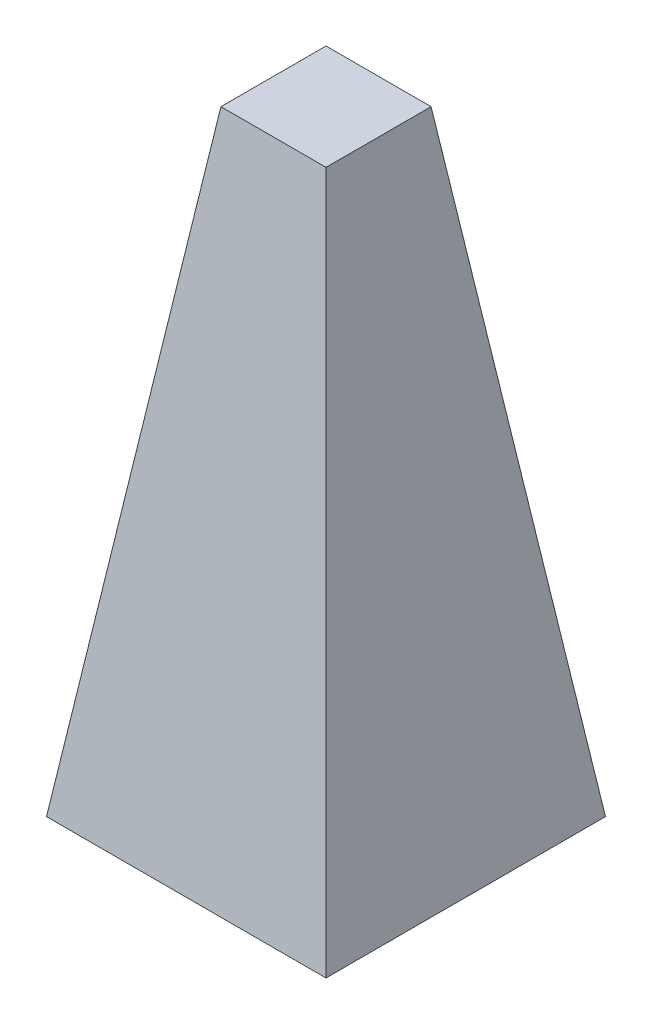
ISO-10303-21;
HEADER;
FILE_DESCRIPTION(('STEP AP214'),'2;1');
FILE_NAME('part.step','',(''),(''),'','','');
FILE_SCHEMA(('AUTOMOTIVE_DESIGN { 1 0 10303 214 1 1 1 1 }'));
ENDSEC;
DATA;
#1=APPLICATION_CONTEXT('core data for automotive mechanical design processes');
#2=APPLICATION_PROTOCOL_DEFINITION('international standard','automotive_design',2000,#1);
#3=PRODUCT_CONTEXT('',#1,'mechanical');
#4=PRODUCT('Part','Part','',(#3));
#5=PRODUCT_RELATED_PRODUCT_CATEGORY('part','',(#4));
#6=PRODUCT_DEFINITION_FORMATION('','',#4);
#7=PRODUCT_DEFINITION_CONTEXT('part definition',#1,'design');
#8=PRODUCT_DEFINITION('design','',#6,#7);
#9=PRODUCT_DEFINITION_SHAPE('','',#8);
#10=(LENGTH_UNIT() NAMED_UNIT(*) SI_UNIT(.MILLI.,.METRE.));
#11=(NAMED_UNIT(*) PLANE_ANGLE_UNIT() SI_UNIT($,.RADIAN.));
#12=(NAMED_UNIT(*) SI_UNIT($,.STERADIAN.) SOLID_ANGLE_UNIT());
#13=UNCERTAINTY_MEASURE_WITH_UNIT(LENGTH_MEASURE(1.E-05),#10,'distance_accuracy_value','');
#14=(GEOMETRIC_REPRESENTATION_CONTEXT(3) GLOBAL_UNCERTAINTY_ASSIGNED_CONTEXT((#13)) GLOBAL_UNIT_ASSIGNED_CONTEXT((#10,
#11,#12)) REPRESENTATION_CONTEXT('',''));
#15=CARTESIAN_POINT('',(0.,0.,0.));
#16=DIRECTION('',(0.,0.,1.));
#17=DIRECTION('',(1.,0.,0.));
#18=AXIS2_PLACEMENT_3D('',#15,#16,#17);
#19=CARTESIAN_POINT('',(0.,279.4,0.));
#20=DIRECTION('',(0.,-1.,0.));
#21=DIRECTION('',(0.,0.,-1.));
#22=AXIS2_PLACEMENT_3D('',#19,#20,#21);
#23=PLANE('',#22);
#24=DIRECTION('',(0.,0.,-1.));
#25=VECTOR('',#24,1.);
#26=CARTESIAN_POINT('',(23.876,279.4,23.876));
#27=LINE('',#26,#25);
#28=CARTESIAN_POINT('',(23.876,279.4,23.876));
#29=VERTEX_POINT('',#28);
#30=CARTESIAN_POINT('',(23.876,279.4,-23.876));
#31=VERTEX_POINT('',#30);
#32=EDGE_CURVE('E223',#29,#31,#27,.T.);
#33=ORIENTED_EDGE('',*,*,#32,.T.);
#34=DIRECTION('',(-1.,0.,0.));
#35=VECTOR('',#34,1.);
#36=CARTESIAN_POINT('',(-23.876,279.4,-23.876));
#37=LINE('',#36,#35);
#38=CARTESIAN_POINT('',(-23.876,279.4,-23.876));
#39=VERTEX_POINT('',#38);
#40=EDGE_CURVE('E218',#31,#39,#37,.T.);
#41=ORIENTED_EDGE('',*,*,#40,.T.);
#42=DIRECTION('',(0.,0.,1.));
#43=VECTOR('',#42,1.);
#44=CARTESIAN_POINT('',(-23.876,279.4,23.876));
#45=LINE('',#44,#43);
#46=CARTESIAN_POINT('',(-23.876,279.4,23.876));
#47=VERTEX_POINT('',#46);
#48=EDGE_CURVE('E59',#39,#47,#45,.T.);
#49=ORIENTED_EDGE('',*,*,#48,.T.);
#50=DIRECTION('',(1.,0.,0.));
#51=VECTOR('',#50,1.);
#52=CARTESIAN_POINT('',(-23.876,279.4,23.876));
#53=LINE('',#52,#51);
#54=EDGE_CURVE('E12',#47,#29,#53,.T.);
#55=ORIENTED_EDGE('',*,*,#54,.T.);
#56=EDGE_LOOP('',(#33,#41,#49,#55));
#57=FACE_BOUND('',#56,.T.);
#58=ADVANCED_FACE('F49',(#57),#23,.F.);
#59=CARTESIAN_POINT('',(0.,0.,0.));
#60=DIRECTION('',(0.,-1.,0.));
#61=DIRECTION('',(0.,0.,-1.));
#62=AXIS2_PLACEMENT_3D('',#59,#60,#61);
#63=PLANE('',#62);
#64=DIRECTION('',(0.,0.,-1.));
#65=VECTOR('',#64,1.);
#66=CARTESIAN_POINT('',(63.5,0.,63.5));
#67=LINE('',#66,#65);
#68=CARTESIAN_POINT('',(63.5,0.,63.5));
#69=VERTEX_POINT('',#68);
#70=CARTESIAN_POINT('',(63.5,0.,-63.5));
#71=VERTEX_POINT('',#70);
#72=EDGE_CURVE('E117',#69,#71,#67,.T.);
#73=ORIENTED_EDGE('',*,*,#72,.F.);
#74=DIRECTION('',(1.,0.,0.));
#75=VECTOR('',#74,1.);
#76=CARTESIAN_POINT('',(-63.5,0.,63.5));
#77=LINE('',#76,#75);
#78=CARTESIAN_POINT('',(-63.5,0.,63.5));
#79=VERTEX_POINT('',#78);
#80=EDGE_CURVE('E101',#79,#69,#77,.T.);
#81=ORIENTED_EDGE('',*,*,#80,.F.);
#82=DIRECTION('',(0.,0.,1.));
#83=VECTOR('',#82,1.);
#84=CARTESIAN_POINT('',(-63.5,0.,63.5));
#85=LINE('',#84,#83);
#86=CARTESIAN_POINT('',(-63.5,0.,-63.5));
#87=VERTEX_POINT('',#86);
#88=EDGE_CURVE('E92',#87,#79,#85,.T.);
#89=ORIENTED_EDGE('',*,*,#88,.F.);
#90=DIRECTION('',(-1.,0.,0.));
#91=VECTOR('',#90,1.);
#92=CARTESIAN_POINT('',(-63.5,0.,-63.5));
#93=LINE('',#92,#91);
#94=EDGE_CURVE('E97',#71,#87,#93,.T.);
#95=ORIENTED_EDGE('',*,*,#94,.F.);
#96=EDGE_LOOP('',(#73,#81,#89,#95));
#97=FACE_BOUND('',#96,.T.);
#98=ADVANCED_FACE('F96',(#97),#63,.T.);
#99=CARTESIAN_POINT('',(0.,8.82790423353122,-62.2480426723356));
#100=DIRECTION('',(0.,-0.140413188225986,0.990092993901186));
#101=DIRECTION('',(0.,-0.990092993901186,-0.140413188225986));
#102=AXIS2_PLACEMENT_3D('',#99,#100,#101);
#103=PLANE('',#102);
#104=DIRECTION('',(0.13904914180307,0.980474717842158,0.13904914180307));
#105=VECTOR('',#104,1.);
#106=CARTESIAN_POINT('',(-63.5,0.,-63.5));
#107=LINE('',#106,#105);
#108=EDGE_CURVE('E113',#87,#39,#107,.T.);
#109=ORIENTED_EDGE('',*,*,#108,.T.);
#110=ORIENTED_EDGE('',*,*,#40,.F.);
#111=DIRECTION('',(-0.13904914180307,0.980474717842158,0.13904914180307));
#112=VECTOR('',#111,1.);
#113=CARTESIAN_POINT('',(63.5,0.,-63.5));
#114=LINE('',#113,#112);
#115=EDGE_CURVE('E116',#71,#31,#114,.T.);
#116=ORIENTED_EDGE('',*,*,#115,.F.);
#117=ORIENTED_EDGE('',*,*,#94,.T.);
#118=EDGE_LOOP('',(#109,#110,#116,#117));
#119=FACE_BOUND('',#118,.T.);
#120=ADVANCED_FACE('F112',(#119),#103,.F.);
#121=CARTESIAN_POINT('',(62.2480426723356,8.82790423353122,0.));
#122=DIRECTION('',(-0.990092993901186,-0.140413188225986,0.));
#123=DIRECTION('',(0.140413188225986,-0.990092993901186,0.));
#124=AXIS2_PLACEMENT_3D('',#121,#122,#123);
#125=PLANE('',#124);
#126=ORIENTED_EDGE('',*,*,#115,.T.);
#127=ORIENTED_EDGE('',*,*,#32,.F.);
#128=DIRECTION('',(-0.13904914180307,0.980474717842158,-0.13904914180307));
#129=VECTOR('',#128,1.);
#130=CARTESIAN_POINT('',(63.5,0.,63.5));
#131=LINE('',#130,#129);
#132=EDGE_CURVE('E229',#69,#29,#131,.T.);
#133=ORIENTED_EDGE('',*,*,#132,.F.);
#134=ORIENTED_EDGE('',*,*,#72,.T.);
#135=EDGE_LOOP('',(#126,#127,#133,#134));
#136=FACE_BOUND('',#135,.T.);
#137=ADVANCED_FACE('F145',(#136),#125,.F.);
#138=CARTESIAN_POINT('',(-62.2480426723356,8.82790423353123,0.));
#139=DIRECTION('',(0.990092993901186,-0.140413188225986,0.));
#140=DIRECTION('',(0.140413188225986,0.990092993901186,0.));
#141=AXIS2_PLACEMENT_3D('',#138,#139,#140);
#142=PLANE('',#141);
#143=DIRECTION('',(0.13904914180307,0.980474717842158,-0.13904914180307));
#144=VECTOR('',#143,1.);
#145=CARTESIAN_POINT('',(-63.5,0.,63.5));
#146=LINE('',#145,#144);
#147=EDGE_CURVE('E74',#79,#47,#146,.T.);
#148=ORIENTED_EDGE('',*,*,#147,.T.);
#149=ORIENTED_EDGE('',*,*,#48,.F.);
#150=ORIENTED_EDGE('',*,*,#108,.F.);
#151=ORIENTED_EDGE('',*,*,#88,.T.);
#152=EDGE_LOOP('',(#148,#149,#150,#151));
#153=FACE_BOUND('',#152,.T.);
#154=ADVANCED_FACE('F121',(#153),#142,.F.);
#155=CARTESIAN_POINT('',(0.,8.82790423353123,62.2480426723356));
#156=DIRECTION('',(0.,-0.140413188225986,-0.990092993901186));
#157=DIRECTION('',(0.,0.990092993901186,-0.140413188225986));
#158=AXIS2_PLACEMENT_3D('',#155,#156,#157);
#159=PLANE('',#158);
#160=ORIENTED_EDGE('',*,*,#132,.T.);
#161=ORIENTED_EDGE('',*,*,#54,.F.);
#162=ORIENTED_EDGE('',*,*,#147,.F.);
#163=ORIENTED_EDGE('',*,*,#80,.T.);
#164=EDGE_LOOP('',(#160,#161,#162,#163));
#165=FACE_BOUND('',#164,.T.);
#166=ADVANCED_FACE('F144',(#165),#159,.F.);
#167=CLOSED_SHELL('',(#58,#98,#120,#137,#154,#166));
#168=MANIFOLD_SOLID_BREP('B2',#167);
#169=ADVANCED_BREP_SHAPE_REPRESENTATION('',(#18,#168),#14);
#170=SHAPE_DEFINITION_REPRESENTATION(#9,#169);
ENDSEC;
END-ISO-10303-21;
